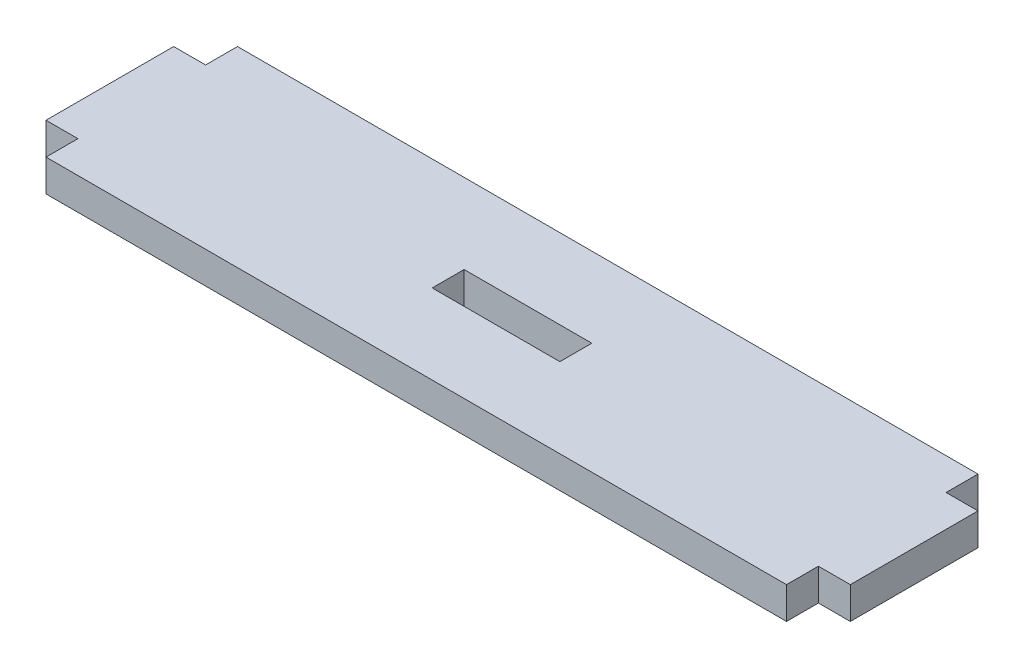
ISO-10303-21;
HEADER;
FILE_DESCRIPTION(('STEP AP214'),'2;1');
FILE_NAME('part.step','',(''),(''),'','','');
FILE_SCHEMA(('AUTOMOTIVE_DESIGN { 1 0 10303 214 1 1 1 1 }'));
ENDSEC;
DATA;
#1=APPLICATION_CONTEXT('core data for automotive mechanical design processes');
#2=APPLICATION_PROTOCOL_DEFINITION('international standard','automotive_design',2000,#1);
#3=PRODUCT_CONTEXT('',#1,'mechanical');
#4=PRODUCT('Part','Part','',(#3));
#5=PRODUCT_RELATED_PRODUCT_CATEGORY('part','',(#4));
#6=PRODUCT_DEFINITION_FORMATION('','',#4);
#7=PRODUCT_DEFINITION_CONTEXT('part definition',#1,'design');
#8=PRODUCT_DEFINITION('design','',#6,#7);
#9=PRODUCT_DEFINITION_SHAPE('','',#8);
#10=(LENGTH_UNIT() NAMED_UNIT(*) SI_UNIT(.MILLI.,.METRE.));
#11=(NAMED_UNIT(*) PLANE_ANGLE_UNIT() SI_UNIT($,.RADIAN.));
#12=(NAMED_UNIT(*) SI_UNIT($,.STERADIAN.) SOLID_ANGLE_UNIT());
#13=UNCERTAINTY_MEASURE_WITH_UNIT(LENGTH_MEASURE(1.E-05),#10,'distance_accuracy_value','');
#14=(GEOMETRIC_REPRESENTATION_CONTEXT(3) GLOBAL_UNCERTAINTY_ASSIGNED_CONTEXT((#13)) GLOBAL_UNIT_ASSIGNED_CONTEXT((#10,
#11,#12)) REPRESENTATION_CONTEXT('',''));
#15=CARTESIAN_POINT('',(0.,0.,0.));
#16=DIRECTION('',(0.,0.,1.));
#17=DIRECTION('',(1.,0.,0.));
#18=AXIS2_PLACEMENT_3D('',#15,#16,#17);
#19=CARTESIAN_POINT('',(0.,5.,0.));
#20=DIRECTION('',(0.,1.,0.));
#21=DIRECTION('',(0.,0.,1.));
#22=AXIS2_PLACEMENT_3D('',#19,#20,#21);
#23=PLANE('',#22);
#24=DIRECTION('',(0.,0.,-1.));
#25=VECTOR('',#24,1.);
#26=CARTESIAN_POINT('',(95.0892982050154,5.,11.6910229031955));
#27=LINE('',#26,#25);
#28=CARTESIAN_POINT('',(95.0892982050154,5.,16.6910229031955));
#29=VERTEX_POINT('',#28);
#30=CARTESIAN_POINT('',(95.0892982050154,5.,11.6910229031955));
#31=VERTEX_POINT('',#30);
#32=EDGE_CURVE('E184',#29,#31,#27,.T.);
#33=ORIENTED_EDGE('',*,*,#32,.T.);
#34=DIRECTION('',(1.,0.,0.));
#35=VECTOR('',#34,1.);
#36=CARTESIAN_POINT('',(95.0892982050154,5.,11.6910229031955));
#37=LINE('',#36,#35);
#38=CARTESIAN_POINT('',(100.089298205015,5.,11.6910229031955));
#39=VERTEX_POINT('',#38);
#40=EDGE_CURVE('E187',#31,#39,#37,.T.);
#41=ORIENTED_EDGE('',*,*,#40,.T.);
#42=DIRECTION('',(0.,0.,-1.));
#43=VECTOR('',#42,1.);
#44=CARTESIAN_POINT('',(100.089298205015,5.,-8.30897709680451));
#45=LINE('',#44,#43);
#46=CARTESIAN_POINT('',(100.089298205015,5.,-8.30897709680451));
#47=VERTEX_POINT('',#46);
#48=EDGE_CURVE('E190',#39,#47,#45,.T.);
#49=ORIENTED_EDGE('',*,*,#48,.T.);
#50=DIRECTION('',(-1.,0.,0.));
#51=VECTOR('',#50,1.);
#52=CARTESIAN_POINT('',(95.0892982050154,5.,-8.30897709680451));
#53=LINE('',#52,#51);
#54=CARTESIAN_POINT('',(95.0892982050154,5.,-8.30897709680451));
#55=VERTEX_POINT('',#54);
#56=EDGE_CURVE('E192',#47,#55,#53,.T.);
#57=ORIENTED_EDGE('',*,*,#56,.T.);
#58=DIRECTION('',(0.,0.,-1.));
#59=VECTOR('',#58,1.);
#60=CARTESIAN_POINT('',(95.0892982050154,5.,-13.3089770968045));
#61=LINE('',#60,#59);
#62=CARTESIAN_POINT('',(95.0892982050154,5.,-13.3089770968045));
#63=VERTEX_POINT('',#62);
#64=EDGE_CURVE('E194',#55,#63,#61,.T.);
#65=ORIENTED_EDGE('',*,*,#64,.T.);
#66=DIRECTION('',(-1.,0.,0.));
#67=VECTOR('',#66,1.);
#68=CARTESIAN_POINT('',(51.5892982050154,5.,-13.3089770968045));
#69=LINE('',#68,#67);
#70=CARTESIAN_POINT('',(-20.9107017949846,5.,-13.3089770968045));
#71=VERTEX_POINT('',#70);
#72=EDGE_CURVE('E196',#63,#71,#69,.T.);
#73=ORIENTED_EDGE('',*,*,#72,.T.);
#74=DIRECTION('',(0.,0.,1.));
#75=VECTOR('',#74,1.);
#76=CARTESIAN_POINT('',(-20.9107017949846,5.,-13.3089770968045));
#77=LINE('',#76,#75);
#78=CARTESIAN_POINT('',(-20.9107017949846,5.,-8.30897709680451));
#79=VERTEX_POINT('',#78);
#80=EDGE_CURVE('E198',#71,#79,#77,.T.);
#81=ORIENTED_EDGE('',*,*,#80,.T.);
#82=DIRECTION('',(-1.,0.,0.));
#83=VECTOR('',#82,1.);
#84=CARTESIAN_POINT('',(-20.9107017949846,5.,-8.30897709680451));
#85=LINE('',#84,#83);
#86=CARTESIAN_POINT('',(-25.9107017949846,5.,-8.30897709680452));
#87=VERTEX_POINT('',#86);
#88=EDGE_CURVE('E200',#79,#87,#85,.T.);
#89=ORIENTED_EDGE('',*,*,#88,.T.);
#90=DIRECTION('',(0.,0.,1.));
#91=VECTOR('',#90,1.);
#92=CARTESIAN_POINT('',(-25.9107017949846,5.,-8.30897709680452));
#93=LINE('',#92,#91);
#94=CARTESIAN_POINT('',(-25.9107017949846,5.,11.6910229031955));
#95=VERTEX_POINT('',#94);
#96=EDGE_CURVE('E202',#87,#95,#93,.T.);
#97=ORIENTED_EDGE('',*,*,#96,.T.);
#98=DIRECTION('',(1.,0.,0.));
#99=VECTOR('',#98,1.);
#100=CARTESIAN_POINT('',(-20.9107017949846,5.,11.6910229031955));
#101=LINE('',#100,#99);
#102=CARTESIAN_POINT('',(-20.9107017949846,5.,11.6910229031955));
#103=VERTEX_POINT('',#102);
#104=EDGE_CURVE('E204',#95,#103,#101,.T.);
#105=ORIENTED_EDGE('',*,*,#104,.T.);
#106=DIRECTION('',(0.,0.,1.));
#107=VECTOR('',#106,1.);
#108=CARTESIAN_POINT('',(-20.9107017949846,5.,11.6910229031955));
#109=LINE('',#108,#107);
#110=CARTESIAN_POINT('',(-20.9107017949846,5.,16.6910229031955));
#111=VERTEX_POINT('',#110);
#112=EDGE_CURVE('E206',#103,#111,#109,.T.);
#113=ORIENTED_EDGE('',*,*,#112,.T.);
#114=DIRECTION('',(1.,0.,0.));
#115=VECTOR('',#114,1.);
#116=CARTESIAN_POINT('',(-20.9107017949846,5.,16.6910229031955));
#117=LINE('',#116,#115);
#118=EDGE_CURVE('E208',#111,#29,#117,.T.);
#119=ORIENTED_EDGE('',*,*,#118,.T.);
#120=EDGE_LOOP('',(#33,#41,#49,#57,#65,#73,#81,#89,#97,#105,#113,#119));
#121=FACE_BOUND('',#120,.T.);
#122=DIRECTION('',(-1.,0.,0.));
#123=VECTOR('',#122,1.);
#124=CARTESIAN_POINT('',(27.0892982050154,5.,-0.808977096804503));
#125=LINE('',#124,#123);
#126=CARTESIAN_POINT('',(47.0892982050154,5.,-0.808977096804504));
#127=VERTEX_POINT('',#126);
#128=CARTESIAN_POINT('',(27.0892982050154,5.,-0.808977096804503));
#129=VERTEX_POINT('',#128);
#130=EDGE_CURVE('E156',#127,#129,#125,.T.);
#131=ORIENTED_EDGE('',*,*,#130,.F.);
#132=DIRECTION('',(0.,0.,-1.));
#133=VECTOR('',#132,1.);
#134=CARTESIAN_POINT('',(47.0892982050154,5.,4.1910229031955));
#135=LINE('',#134,#133);
#136=CARTESIAN_POINT('',(47.0892982050154,5.,4.1910229031955));
#137=VERTEX_POINT('',#136);
#138=EDGE_CURVE('E148',#137,#127,#135,.T.);
#139=ORIENTED_EDGE('',*,*,#138,.F.);
#140=DIRECTION('',(1.,0.,0.));
#141=VECTOR('',#140,1.);
#142=CARTESIAN_POINT('',(27.0892982050154,5.,4.1910229031955));
#143=LINE('',#142,#141);
#144=CARTESIAN_POINT('',(27.0892982050154,5.,4.1910229031955));
#145=VERTEX_POINT('',#144);
#146=EDGE_CURVE('E170',#145,#137,#143,.T.);
#147=ORIENTED_EDGE('',*,*,#146,.F.);
#148=DIRECTION('',(0.,0.,1.));
#149=VECTOR('',#148,1.);
#150=CARTESIAN_POINT('',(27.0892982050154,5.,4.1910229031955));
#151=LINE('',#150,#149);
#152=EDGE_CURVE('E168',#129,#145,#151,.T.);
#153=ORIENTED_EDGE('',*,*,#152,.F.);
#154=EDGE_LOOP('',(#131,#139,#147,#153));
#155=FACE_BOUND('',#154,.T.);
#156=ADVANCED_FACE('F35',(#121,#155),#23,.T.);
#157=CARTESIAN_POINT('',(0.,0.,0.));
#158=DIRECTION('',(0.,1.,0.));
#159=DIRECTION('',(0.,0.,1.));
#160=AXIS2_PLACEMENT_3D('',#157,#158,#159);
#161=PLANE('',#160);
#162=DIRECTION('',(0.,0.,-1.));
#163=VECTOR('',#162,1.);
#164=CARTESIAN_POINT('',(95.0892982050154,0.,11.6910229031955));
#165=LINE('',#164,#163);
#166=CARTESIAN_POINT('',(95.0892982050154,0.,16.6910229031955));
#167=VERTEX_POINT('',#166);
#168=CARTESIAN_POINT('',(95.0892982050154,0.,11.6910229031955));
#169=VERTEX_POINT('',#168);
#170=EDGE_CURVE('E164',#167,#169,#165,.T.);
#171=ORIENTED_EDGE('',*,*,#170,.F.);
#172=DIRECTION('',(1.,0.,0.));
#173=VECTOR('',#172,1.);
#174=CARTESIAN_POINT('',(-20.9107017949846,0.,16.6910229031955));
#175=LINE('',#174,#173);
#176=CARTESIAN_POINT('',(-20.9107017949846,0.,16.6910229031955));
#177=VERTEX_POINT('',#176);
#178=EDGE_CURVE('E188',#177,#167,#175,.T.);
#179=ORIENTED_EDGE('',*,*,#178,.F.);
#180=DIRECTION('',(0.,0.,1.));
#181=VECTOR('',#180,1.);
#182=CARTESIAN_POINT('',(-20.9107017949846,0.,11.6910229031955));
#183=LINE('',#182,#181);
#184=CARTESIAN_POINT('',(-20.9107017949846,0.,11.6910229031955));
#185=VERTEX_POINT('',#184);
#186=EDGE_CURVE('E232',#185,#177,#183,.T.);
#187=ORIENTED_EDGE('',*,*,#186,.F.);
#188=DIRECTION('',(1.,0.,0.));
#189=VECTOR('',#188,1.);
#190=CARTESIAN_POINT('',(-20.9107017949846,0.,11.6910229031955));
#191=LINE('',#190,#189);
#192=CARTESIAN_POINT('',(-25.9107017949846,0.,11.6910229031955));
#193=VERTEX_POINT('',#192);
#194=EDGE_CURVE('E230',#193,#185,#191,.T.);
#195=ORIENTED_EDGE('',*,*,#194,.F.);
#196=DIRECTION('',(0.,0.,1.));
#197=VECTOR('',#196,1.);
#198=CARTESIAN_POINT('',(-25.9107017949846,0.,-8.30897709680452));
#199=LINE('',#198,#197);
#200=CARTESIAN_POINT('',(-25.9107017949846,0.,-8.30897709680452));
#201=VERTEX_POINT('',#200);
#202=EDGE_CURVE('E228',#201,#193,#199,.T.);
#203=ORIENTED_EDGE('',*,*,#202,.F.);
#204=DIRECTION('',(-1.,0.,0.));
#205=VECTOR('',#204,1.);
#206=CARTESIAN_POINT('',(-20.9107017949846,0.,-8.30897709680451));
#207=LINE('',#206,#205);
#208=CARTESIAN_POINT('',(-20.9107017949846,0.,-8.30897709680451));
#209=VERTEX_POINT('',#208);
#210=EDGE_CURVE('E226',#209,#201,#207,.T.);
#211=ORIENTED_EDGE('',*,*,#210,.F.);
#212=DIRECTION('',(0.,0.,1.));
#213=VECTOR('',#212,1.);
#214=CARTESIAN_POINT('',(-20.9107017949846,0.,-13.3089770968045));
#215=LINE('',#214,#213);
#216=CARTESIAN_POINT('',(-20.9107017949846,0.,-13.3089770968045));
#217=VERTEX_POINT('',#216);
#218=EDGE_CURVE('E224',#217,#209,#215,.T.);
#219=ORIENTED_EDGE('',*,*,#218,.F.);
#220=DIRECTION('',(-1.,0.,0.));
#221=VECTOR('',#220,1.);
#222=CARTESIAN_POINT('',(22.5892982050154,0.,-13.3089770968045));
#223=LINE('',#222,#221);
#224=CARTESIAN_POINT('',(95.0892982050154,0.,-13.3089770968045));
#225=VERTEX_POINT('',#224);
#226=EDGE_CURVE('E222',#225,#217,#223,.T.);
#227=ORIENTED_EDGE('',*,*,#226,.F.);
#228=DIRECTION('',(0.,0.,-1.));
#229=VECTOR('',#228,1.);
#230=CARTESIAN_POINT('',(95.0892982050154,0.,-13.3089770968045));
#231=LINE('',#230,#229);
#232=CARTESIAN_POINT('',(95.0892982050154,0.,-8.30897709680451));
#233=VERTEX_POINT('',#232);
#234=EDGE_CURVE('E219',#233,#225,#231,.T.);
#235=ORIENTED_EDGE('',*,*,#234,.F.);
#236=DIRECTION('',(-1.,0.,0.));
#237=VECTOR('',#236,1.);
#238=CARTESIAN_POINT('',(95.0892982050154,0.,-8.30897709680451));
#239=LINE('',#238,#237);
#240=CARTESIAN_POINT('',(100.089298205015,0.,-8.30897709680451));
#241=VERTEX_POINT('',#240);
#242=EDGE_CURVE('E217',#241,#233,#239,.T.);
#243=ORIENTED_EDGE('',*,*,#242,.F.);
#244=DIRECTION('',(0.,0.,-1.));
#245=VECTOR('',#244,1.);
#246=CARTESIAN_POINT('',(100.089298205015,0.,-8.30897709680451));
#247=LINE('',#246,#245);
#248=CARTESIAN_POINT('',(100.089298205015,0.,11.6910229031955));
#249=VERTEX_POINT('',#248);
#250=EDGE_CURVE('E215',#249,#241,#247,.T.);
#251=ORIENTED_EDGE('',*,*,#250,.F.);
#252=DIRECTION('',(1.,0.,0.));
#253=VECTOR('',#252,1.);
#254=CARTESIAN_POINT('',(95.0892982050154,0.,11.6910229031955));
#255=LINE('',#254,#253);
#256=EDGE_CURVE('E213',#169,#249,#255,.T.);
#257=ORIENTED_EDGE('',*,*,#256,.F.);
#258=EDGE_LOOP('',(#171,#179,#187,#195,#203,#211,#219,#227,#235,#243,#251,#257));
#259=FACE_BOUND('',#258,.T.);
#260=DIRECTION('',(0.,0.,-1.));
#261=VECTOR('',#260,1.);
#262=CARTESIAN_POINT('',(47.0892982050154,0.,4.1910229031955));
#263=LINE('',#262,#261);
#264=CARTESIAN_POINT('',(47.0892982050154,0.,4.1910229031955));
#265=VERTEX_POINT('',#264);
#266=CARTESIAN_POINT('',(47.0892982050154,0.,-0.808977096804504));
#267=VERTEX_POINT('',#266);
#268=EDGE_CURVE('E58',#265,#267,#263,.T.);
#269=ORIENTED_EDGE('',*,*,#268,.T.);
#270=DIRECTION('',(-1.,0.,0.));
#271=VECTOR('',#270,1.);
#272=CARTESIAN_POINT('',(27.0892982050154,0.,-0.808977096804503));
#273=LINE('',#272,#271);
#274=CARTESIAN_POINT('',(27.0892982050154,0.,-0.808977096804503));
#275=VERTEX_POINT('',#274);
#276=EDGE_CURVE('E163',#267,#275,#273,.T.);
#277=ORIENTED_EDGE('',*,*,#276,.T.);
#278=DIRECTION('',(0.,0.,1.));
#279=VECTOR('',#278,1.);
#280=CARTESIAN_POINT('',(27.0892982050154,0.,4.1910229031955));
#281=LINE('',#280,#279);
#282=CARTESIAN_POINT('',(27.0892982050154,0.,4.1910229031955));
#283=VERTEX_POINT('',#282);
#284=EDGE_CURVE('E176',#275,#283,#281,.T.);
#285=ORIENTED_EDGE('',*,*,#284,.T.);
#286=DIRECTION('',(1.,0.,0.));
#287=VECTOR('',#286,1.);
#288=CARTESIAN_POINT('',(27.0892982050154,0.,4.1910229031955));
#289=LINE('',#288,#287);
#290=EDGE_CURVE('E157',#283,#265,#289,.T.);
#291=ORIENTED_EDGE('',*,*,#290,.T.);
#292=EDGE_LOOP('',(#269,#277,#285,#291));
#293=FACE_BOUND('',#292,.T.);
#294=ADVANCED_FACE('F274',(#259,#293),#161,.F.);
#295=CARTESIAN_POINT('',(95.0892982050154,5.,11.6910229031955));
#296=DIRECTION('',(-1.,0.,0.));
#297=DIRECTION('',(0.,0.,1.));
#298=AXIS2_PLACEMENT_3D('',#295,#296,#297);
#299=PLANE('',#298);
#300=ORIENTED_EDGE('',*,*,#170,.T.);
#301=DIRECTION('',(0.,-1.,0.));
#302=VECTOR('',#301,1.);
#303=CARTESIAN_POINT('',(95.0892982050154,5.,11.6910229031955));
#304=LINE('',#303,#302);
#305=EDGE_CURVE('E11',#31,#169,#304,.T.);
#306=ORIENTED_EDGE('',*,*,#305,.F.);
#307=ORIENTED_EDGE('',*,*,#32,.F.);
#308=DIRECTION('',(0.,-1.,0.));
#309=VECTOR('',#308,1.);
#310=CARTESIAN_POINT('',(95.0892982050154,5.,16.6910229031955));
#311=LINE('',#310,#309);
#312=EDGE_CURVE('E210',#29,#167,#311,.T.);
#313=ORIENTED_EDGE('',*,*,#312,.T.);
#314=EDGE_LOOP('',(#300,#306,#307,#313));
#315=FACE_BOUND('',#314,.T.);
#316=ADVANCED_FACE('F37',(#315),#299,.F.);
#317=CARTESIAN_POINT('',(95.0892982050154,5.,11.6910229031955));
#318=DIRECTION('',(0.,0.,-1.));
#319=DIRECTION('',(-1.,0.,0.));
#320=AXIS2_PLACEMENT_3D('',#317,#318,#319);
#321=PLANE('',#320);
#322=ORIENTED_EDGE('',*,*,#256,.T.);
#323=DIRECTION('',(0.,-1.,0.));
#324=VECTOR('',#323,1.);
#325=CARTESIAN_POINT('',(100.089298205015,5.,11.6910229031955));
#326=LINE('',#325,#324);
#327=EDGE_CURVE('E43',#39,#249,#326,.T.);
#328=ORIENTED_EDGE('',*,*,#327,.F.);
#329=ORIENTED_EDGE('',*,*,#40,.F.);
#330=ORIENTED_EDGE('',*,*,#305,.T.);
#331=EDGE_LOOP('',(#322,#328,#329,#330));
#332=FACE_BOUND('',#331,.T.);
#333=ADVANCED_FACE('F290',(#332),#321,.F.);
#334=CARTESIAN_POINT('',(100.089298205015,5.,-8.30897709680451));
#335=DIRECTION('',(-1.,0.,0.));
#336=DIRECTION('',(0.,0.,1.));
#337=AXIS2_PLACEMENT_3D('',#334,#335,#336);
#338=PLANE('',#337);
#339=ORIENTED_EDGE('',*,*,#250,.T.);
#340=DIRECTION('',(0.,-1.,0.));
#341=VECTOR('',#340,1.);
#342=CARTESIAN_POINT('',(100.089298205015,5.,-8.30897709680451));
#343=LINE('',#342,#341);
#344=EDGE_CURVE('E261',#47,#241,#343,.T.);
#345=ORIENTED_EDGE('',*,*,#344,.F.);
#346=ORIENTED_EDGE('',*,*,#48,.F.);
#347=ORIENTED_EDGE('',*,*,#327,.T.);
#348=EDGE_LOOP('',(#339,#345,#346,#347));
#349=FACE_BOUND('',#348,.T.);
#350=ADVANCED_FACE('F268',(#349),#338,.F.);
#351=CARTESIAN_POINT('',(95.0892982050154,5.,-8.30897709680451));
#352=DIRECTION('',(0.,0.,1.));
#353=DIRECTION('',(1.,0.,0.));
#354=AXIS2_PLACEMENT_3D('',#351,#352,#353);
#355=PLANE('',#354);
#356=ORIENTED_EDGE('',*,*,#242,.T.);
#357=DIRECTION('',(0.,-1.,0.));
#358=VECTOR('',#357,1.);
#359=CARTESIAN_POINT('',(95.0892982050154,5.,-8.30897709680451));
#360=LINE('',#359,#358);
#361=EDGE_CURVE('E258',#55,#233,#360,.T.);
#362=ORIENTED_EDGE('',*,*,#361,.F.);
#363=ORIENTED_EDGE('',*,*,#56,.F.);
#364=ORIENTED_EDGE('',*,*,#344,.T.);
#365=EDGE_LOOP('',(#356,#362,#363,#364));
#366=FACE_BOUND('',#365,.T.);
#367=ADVANCED_FACE('F279',(#366),#355,.F.);
#368=CARTESIAN_POINT('',(95.0892982050154,5.,-13.3089770968045));
#369=DIRECTION('',(-1.,0.,0.));
#370=DIRECTION('',(0.,0.,1.));
#371=AXIS2_PLACEMENT_3D('',#368,#369,#370);
#372=PLANE('',#371);
#373=ORIENTED_EDGE('',*,*,#234,.T.);
#374=DIRECTION('',(0.,-1.,0.));
#375=VECTOR('',#374,1.);
#376=CARTESIAN_POINT('',(95.0892982050154,5.,-13.3089770968045));
#377=LINE('',#376,#375);
#378=EDGE_CURVE('E255',#63,#225,#377,.T.);
#379=ORIENTED_EDGE('',*,*,#378,.F.);
#380=ORIENTED_EDGE('',*,*,#64,.F.);
#381=ORIENTED_EDGE('',*,*,#361,.T.);
#382=EDGE_LOOP('',(#373,#379,#380,#381));
#383=FACE_BOUND('',#382,.T.);
#384=ADVANCED_FACE('F283',(#383),#372,.F.);
#385=CARTESIAN_POINT('',(22.5892982050154,5.,-13.3089770968045));
#386=DIRECTION('',(0.,0.,1.));
#387=DIRECTION('',(1.,0.,0.));
#388=AXIS2_PLACEMENT_3D('',#385,#386,#387);
#389=PLANE('',#388);
#390=ORIENTED_EDGE('',*,*,#226,.T.);
#391=DIRECTION('',(0.,-1.,0.));
#392=VECTOR('',#391,1.);
#393=CARTESIAN_POINT('',(-20.9107017949846,5.,-13.3089770968045));
#394=LINE('',#393,#392);
#395=EDGE_CURVE('E252',#71,#217,#394,.T.);
#396=ORIENTED_EDGE('',*,*,#395,.F.);
#397=ORIENTED_EDGE('',*,*,#72,.F.);
#398=ORIENTED_EDGE('',*,*,#378,.T.);
#399=EDGE_LOOP('',(#390,#396,#397,#398));
#400=FACE_BOUND('',#399,.T.);
#401=ADVANCED_FACE('F323',(#400),#389,.F.);
#402=CARTESIAN_POINT('',(-20.9107017949846,5.,-13.3089770968045));
#403=DIRECTION('',(1.,0.,0.));
#404=DIRECTION('',(0.,0.,-1.));
#405=AXIS2_PLACEMENT_3D('',#402,#403,#404);
#406=PLANE('',#405);
#407=ORIENTED_EDGE('',*,*,#218,.T.);
#408=DIRECTION('',(0.,-1.,0.));
#409=VECTOR('',#408,1.);
#410=CARTESIAN_POINT('',(-20.9107017949846,5.,-8.30897709680451));
#411=LINE('',#410,#409);
#412=EDGE_CURVE('E249',#79,#209,#411,.T.);
#413=ORIENTED_EDGE('',*,*,#412,.F.);
#414=ORIENTED_EDGE('',*,*,#80,.F.);
#415=ORIENTED_EDGE('',*,*,#395,.T.);
#416=EDGE_LOOP('',(#407,#413,#414,#415));
#417=FACE_BOUND('',#416,.T.);
#418=ADVANCED_FACE('F321',(#417),#406,.F.);
#419=CARTESIAN_POINT('',(-20.9107017949846,5.,-8.30897709680451));
#420=DIRECTION('',(0.,0.,1.));
#421=DIRECTION('',(1.,0.,0.));
#422=AXIS2_PLACEMENT_3D('',#419,#420,#421);
#423=PLANE('',#422);
#424=ORIENTED_EDGE('',*,*,#210,.T.);
#425=DIRECTION('',(0.,-1.,0.));
#426=VECTOR('',#425,1.);
#427=CARTESIAN_POINT('',(-25.9107017949846,5.,-8.30897709680452));
#428=LINE('',#427,#426);
#429=EDGE_CURVE('E246',#87,#201,#428,.T.);
#430=ORIENTED_EDGE('',*,*,#429,.F.);
#431=ORIENTED_EDGE('',*,*,#88,.F.);
#432=ORIENTED_EDGE('',*,*,#412,.T.);
#433=EDGE_LOOP('',(#424,#430,#431,#432));
#434=FACE_BOUND('',#433,.T.);
#435=ADVANCED_FACE('F317',(#434),#423,.F.);
#436=CARTESIAN_POINT('',(-25.9107017949846,5.,-8.30897709680452));
#437=DIRECTION('',(1.,0.,0.));
#438=DIRECTION('',(0.,0.,-1.));
#439=AXIS2_PLACEMENT_3D('',#436,#437,#438);
#440=PLANE('',#439);
#441=ORIENTED_EDGE('',*,*,#202,.T.);
#442=DIRECTION('',(0.,-1.,0.));
#443=VECTOR('',#442,1.);
#444=CARTESIAN_POINT('',(-25.9107017949846,5.,11.6910229031955));
#445=LINE('',#444,#443);
#446=EDGE_CURVE('E243',#95,#193,#445,.T.);
#447=ORIENTED_EDGE('',*,*,#446,.F.);
#448=ORIENTED_EDGE('',*,*,#96,.F.);
#449=ORIENTED_EDGE('',*,*,#429,.T.);
#450=EDGE_LOOP('',(#441,#447,#448,#449));
#451=FACE_BOUND('',#450,.T.);
#452=ADVANCED_FACE('F312',(#451),#440,.F.);
#453=CARTESIAN_POINT('',(-20.9107017949846,5.,11.6910229031955));
#454=DIRECTION('',(0.,0.,-1.));
#455=DIRECTION('',(-1.,0.,0.));
#456=AXIS2_PLACEMENT_3D('',#453,#454,#455);
#457=PLANE('',#456);
#458=ORIENTED_EDGE('',*,*,#194,.T.);
#459=DIRECTION('',(0.,-1.,0.));
#460=VECTOR('',#459,1.);
#461=CARTESIAN_POINT('',(-20.9107017949846,5.,11.6910229031955));
#462=LINE('',#461,#460);
#463=EDGE_CURVE('E240',#103,#185,#462,.T.);
#464=ORIENTED_EDGE('',*,*,#463,.F.);
#465=ORIENTED_EDGE('',*,*,#104,.F.);
#466=ORIENTED_EDGE('',*,*,#446,.T.);
#467=EDGE_LOOP('',(#458,#464,#465,#466));
#468=FACE_BOUND('',#467,.T.);
#469=ADVANCED_FACE('F306',(#468),#457,.F.);
#470=CARTESIAN_POINT('',(-20.9107017949846,5.,11.6910229031955));
#471=DIRECTION('',(1.,0.,0.));
#472=DIRECTION('',(0.,0.,-1.));
#473=AXIS2_PLACEMENT_3D('',#470,#471,#472);
#474=PLANE('',#473);
#475=ORIENTED_EDGE('',*,*,#186,.T.);
#476=DIRECTION('',(0.,-1.,0.));
#477=VECTOR('',#476,1.);
#478=CARTESIAN_POINT('',(-20.9107017949846,5.,16.6910229031955));
#479=LINE('',#478,#477);
#480=EDGE_CURVE('E237',#111,#177,#479,.T.);
#481=ORIENTED_EDGE('',*,*,#480,.F.);
#482=ORIENTED_EDGE('',*,*,#112,.F.);
#483=ORIENTED_EDGE('',*,*,#463,.T.);
#484=EDGE_LOOP('',(#475,#481,#482,#483));
#485=FACE_BOUND('',#484,.T.);
#486=ADVANCED_FACE('F302',(#485),#474,.F.);
#487=CARTESIAN_POINT('',(-20.9107017949846,5.,16.6910229031955));
#488=DIRECTION('',(0.,0.,-1.));
#489=DIRECTION('',(-1.,0.,0.));
#490=AXIS2_PLACEMENT_3D('',#487,#488,#489);
#491=PLANE('',#490);
#492=ORIENTED_EDGE('',*,*,#178,.T.);
#493=ORIENTED_EDGE('',*,*,#312,.F.);
#494=ORIENTED_EDGE('',*,*,#118,.F.);
#495=ORIENTED_EDGE('',*,*,#480,.T.);
#496=EDGE_LOOP('',(#492,#493,#494,#495));
#497=FACE_BOUND('',#496,.T.);
#498=ADVANCED_FACE('F297',(#497),#491,.F.);
#499=CARTESIAN_POINT('',(47.0892982050154,5.,4.1910229031955));
#500=DIRECTION('',(-1.,0.,0.));
#501=DIRECTION('',(0.,0.,1.));
#502=AXIS2_PLACEMENT_3D('',#499,#500,#501);
#503=PLANE('',#502);
#504=ORIENTED_EDGE('',*,*,#268,.F.);
#505=DIRECTION('',(0.,-1.,0.));
#506=VECTOR('',#505,1.);
#507=CARTESIAN_POINT('',(47.0892982050154,5.,4.1910229031955));
#508=LINE('',#507,#506);
#509=EDGE_CURVE('E152',#137,#265,#508,.T.);
#510=ORIENTED_EDGE('',*,*,#509,.F.);
#511=ORIENTED_EDGE('',*,*,#138,.T.);
#512=DIRECTION('',(0.,-1.,0.));
#513=VECTOR('',#512,1.);
#514=CARTESIAN_POINT('',(47.0892982050154,5.,-0.808977096804504));
#515=LINE('',#514,#513);
#516=EDGE_CURVE('E151',#127,#267,#515,.T.);
#517=ORIENTED_EDGE('',*,*,#516,.T.);
#518=EDGE_LOOP('',(#504,#510,#511,#517));
#519=FACE_BOUND('',#518,.T.);
#520=ADVANCED_FACE('F150',(#519),#503,.T.);
#521=CARTESIAN_POINT('',(27.0892982050154,5.,-0.808977096804503));
#522=DIRECTION('',(0.,0.,1.));
#523=DIRECTION('',(1.,0.,0.));
#524=AXIS2_PLACEMENT_3D('',#521,#522,#523);
#525=PLANE('',#524);
#526=ORIENTED_EDGE('',*,*,#276,.F.);
#527=ORIENTED_EDGE('',*,*,#516,.F.);
#528=ORIENTED_EDGE('',*,*,#130,.T.);
#529=DIRECTION('',(0.,-1.,0.));
#530=VECTOR('',#529,1.);
#531=CARTESIAN_POINT('',(27.0892982050154,5.,-0.808977096804503));
#532=LINE('',#531,#530);
#533=EDGE_CURVE('E165',#129,#275,#532,.T.);
#534=ORIENTED_EDGE('',*,*,#533,.T.);
#535=EDGE_LOOP('',(#526,#527,#528,#534));
#536=FACE_BOUND('',#535,.T.);
#537=ADVANCED_FACE('F160',(#536),#525,.T.);
#538=CARTESIAN_POINT('',(27.0892982050154,5.,4.1910229031955));
#539=DIRECTION('',(1.,0.,0.));
#540=DIRECTION('',(0.,0.,-1.));
#541=AXIS2_PLACEMENT_3D('',#538,#539,#540);
#542=PLANE('',#541);
#543=ORIENTED_EDGE('',*,*,#284,.F.);
#544=ORIENTED_EDGE('',*,*,#533,.F.);
#545=ORIENTED_EDGE('',*,*,#152,.T.);
#546=DIRECTION('',(0.,-1.,0.));
#547=VECTOR('',#546,1.);
#548=CARTESIAN_POINT('',(27.0892982050154,5.,4.1910229031955));
#549=LINE('',#548,#547);
#550=EDGE_CURVE('E50',#145,#283,#549,.T.);
#551=ORIENTED_EDGE('',*,*,#550,.T.);
#552=EDGE_LOOP('',(#543,#544,#545,#551));
#553=FACE_BOUND('',#552,.T.);
#554=ADVANCED_FACE('F381',(#553),#542,.T.);
#555=CARTESIAN_POINT('',(27.0892982050154,5.,4.1910229031955));
#556=DIRECTION('',(0.,0.,-1.));
#557=DIRECTION('',(-1.,0.,0.));
#558=AXIS2_PLACEMENT_3D('',#555,#556,#557);
#559=PLANE('',#558);
#560=ORIENTED_EDGE('',*,*,#290,.F.);
#561=ORIENTED_EDGE('',*,*,#550,.F.);
#562=ORIENTED_EDGE('',*,*,#146,.T.);
#563=ORIENTED_EDGE('',*,*,#509,.T.);
#564=EDGE_LOOP('',(#560,#561,#562,#563));
#565=FACE_BOUND('',#564,.T.);
#566=ADVANCED_FACE('F387',(#565),#559,.T.);
#567=CLOSED_SHELL('',(#156,#294,#316,#333,#350,#367,#384,#401,#418,#435,#452,#469,#486,#498,
#520,#537,#554,#566));
#568=MANIFOLD_SOLID_BREP('B2',#567);
#569=ADVANCED_BREP_SHAPE_REPRESENTATION('',(#18,#568),#14);
#570=SHAPE_DEFINITION_REPRESENTATION(#9,#569);
ENDSEC;
END-ISO-10303-21;
